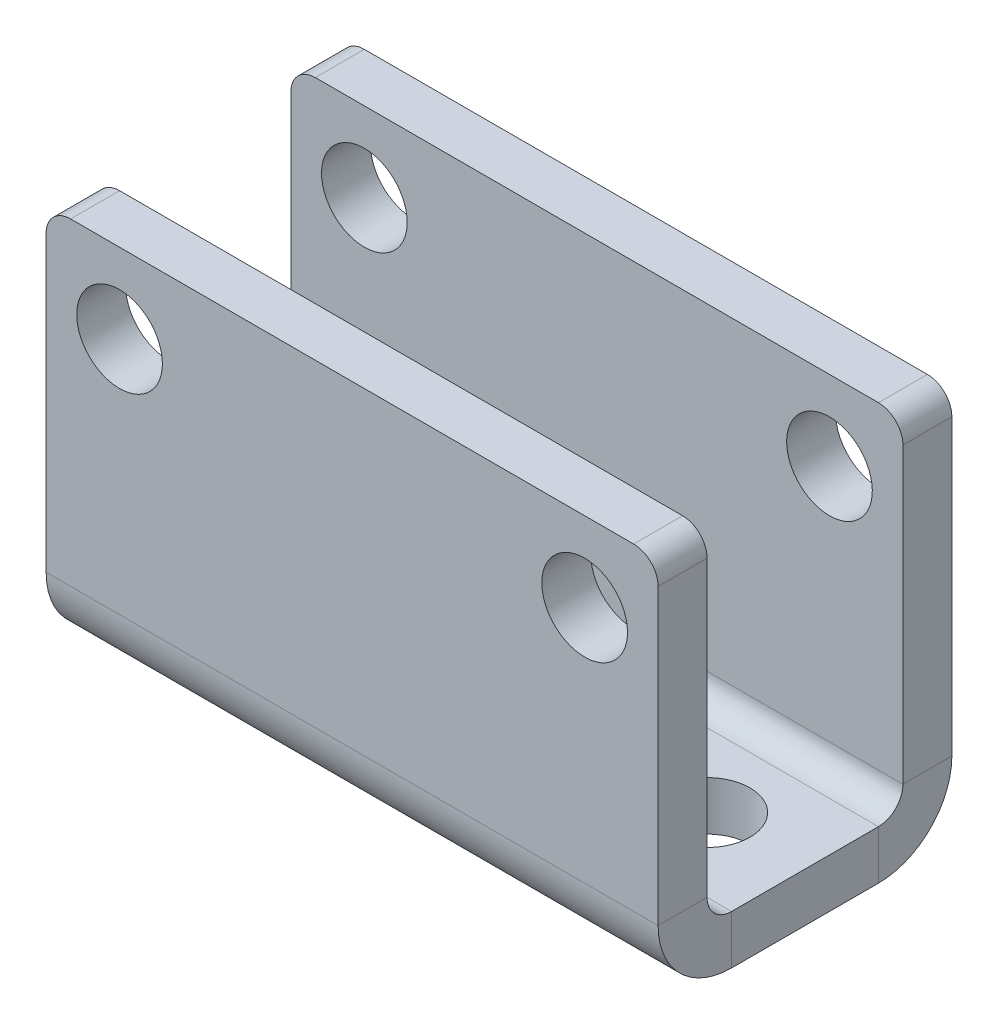
ISO-10303-21;
HEADER;
FILE_DESCRIPTION(('STEP AP214'),'2;1');
FILE_NAME('part.step','',(''),(''),'','','');
FILE_SCHEMA(('AUTOMOTIVE_DESIGN { 1 0 10303 214 1 1 1 1 }'));
ENDSEC;
DATA;
#1=APPLICATION_CONTEXT('core data for automotive mechanical design processes');
#2=APPLICATION_PROTOCOL_DEFINITION('international standard','automotive_design',2000,#1);
#3=PRODUCT_CONTEXT('',#1,'mechanical');
#4=PRODUCT('Part','Part','',(#3));
#5=PRODUCT_RELATED_PRODUCT_CATEGORY('part','',(#4));
#6=PRODUCT_DEFINITION_FORMATION('','',#4);
#7=PRODUCT_DEFINITION_CONTEXT('part definition',#1,'design');
#8=PRODUCT_DEFINITION('design','',#6,#7);
#9=PRODUCT_DEFINITION_SHAPE('','',#8);
#10=(LENGTH_UNIT() NAMED_UNIT(*) SI_UNIT(.MILLI.,.METRE.));
#11=(NAMED_UNIT(*) PLANE_ANGLE_UNIT() SI_UNIT($,.RADIAN.));
#12=(NAMED_UNIT(*) SI_UNIT($,.STERADIAN.) SOLID_ANGLE_UNIT());
#13=UNCERTAINTY_MEASURE_WITH_UNIT(LENGTH_MEASURE(1.E-05),#10,'distance_accuracy_value','');
#14=(GEOMETRIC_REPRESENTATION_CONTEXT(3) GLOBAL_UNCERTAINTY_ASSIGNED_CONTEXT((#13)) GLOBAL_UNIT_ASSIGNED_CONTEXT((#10,
#11,#12)) REPRESENTATION_CONTEXT('',''));
#15=CARTESIAN_POINT('',(0.,0.,0.));
#16=DIRECTION('',(0.,0.,1.));
#17=DIRECTION('',(1.,0.,0.));
#18=AXIS2_PLACEMENT_3D('',#15,#16,#17);
#19=CARTESIAN_POINT('',(0.,0.,-10.));
#20=DIRECTION('',(1.,0.,0.));
#21=DIRECTION('',(0.,0.,-1.));
#22=AXIS2_PLACEMENT_3D('',#19,#20,#21);
#23=PLANE('',#22);
#24=DIRECTION('',(0.,-1.,0.));
#25=VECTOR('',#24,1.);
#26=CARTESIAN_POINT('',(0.,1.99999999999996,-7.00000000000001));
#27=LINE('',#26,#25);
#28=CARTESIAN_POINT('',(0.,1.99999999999998,-7.00000000000001));
#29=VERTEX_POINT('',#28);
#30=CARTESIAN_POINT('',(0.,0.,-7.));
#31=VERTEX_POINT('',#30);
#32=EDGE_CURVE('E252',#29,#31,#27,.T.);
#33=ORIENTED_EDGE('',*,*,#32,.T.);
#34=DIRECTION('',(0.,0.,-1.));
#35=VECTOR('',#34,1.);
#36=CARTESIAN_POINT('',(0.,0.,0.));
#37=LINE('',#36,#35);
#38=CARTESIAN_POINT('',(0.,0.,-0.99999999999999));
#39=VERTEX_POINT('',#38);
#40=EDGE_CURVE('E269',#39,#31,#37,.T.);
#41=ORIENTED_EDGE('',*,*,#40,.F.);
#42=DIRECTION('',(0.,1.,0.));
#43=VECTOR('',#42,1.);
#44=CARTESIAN_POINT('',(0.,2.,-0.999999999999997));
#45=LINE('',#44,#43);
#46=CARTESIAN_POINT('',(0.,2.,-0.999999999999997));
#47=VERTEX_POINT('',#46);
#48=EDGE_CURVE('E279',#47,#39,#45,.F.);
#49=ORIENTED_EDGE('',*,*,#48,.F.);
#50=DIRECTION('',(0.,0.,1.));
#51=VECTOR('',#50,1.);
#52=CARTESIAN_POINT('',(0.,1.99999999999996,-10.));
#53=LINE('',#52,#51);
#54=EDGE_CURVE('E273',#47,#29,#53,.F.);
#55=ORIENTED_EDGE('',*,*,#54,.T.);
#56=EDGE_LOOP('',(#33,#41,#49,#55));
#57=FACE_BOUND('',#56,.T.);
#58=ADVANCED_FACE('F79',(#57),#23,.F.);
#59=CARTESIAN_POINT('',(25.,0.,0.));
#60=DIRECTION('',(-1.,0.,0.));
#61=DIRECTION('',(0.,0.,1.));
#62=AXIS2_PLACEMENT_3D('',#59,#60,#61);
#63=PLANE('',#62);
#64=DIRECTION('',(0.,-1.,0.));
#65=VECTOR('',#64,1.);
#66=CARTESIAN_POINT('',(25.,1.99999999999996,-7.00000000000001));
#67=LINE('',#66,#65);
#68=CARTESIAN_POINT('',(25.,1.99999999999996,-7.00000000000001));
#69=VERTEX_POINT('',#68);
#70=CARTESIAN_POINT('',(25.,0.,-7.));
#71=VERTEX_POINT('',#70);
#72=EDGE_CURVE('E260',#69,#71,#67,.T.);
#73=ORIENTED_EDGE('',*,*,#72,.F.);
#74=DIRECTION('',(0.,0.,-1.));
#75=VECTOR('',#74,1.);
#76=CARTESIAN_POINT('',(25.,2.,0.));
#77=LINE('',#76,#75);
#78=CARTESIAN_POINT('',(25.,2.,-0.999999999999997));
#79=VERTEX_POINT('',#78);
#80=EDGE_CURVE('E271',#69,#79,#77,.F.);
#81=ORIENTED_EDGE('',*,*,#80,.T.);
#82=DIRECTION('',(0.,1.,0.));
#83=VECTOR('',#82,1.);
#84=CARTESIAN_POINT('',(25.,0.,-0.99999999999999));
#85=LINE('',#84,#83);
#86=CARTESIAN_POINT('',(25.,0.,-0.99999999999999));
#87=VERTEX_POINT('',#86);
#88=EDGE_CURVE('E263',#79,#87,#85,.F.);
#89=ORIENTED_EDGE('',*,*,#88,.T.);
#90=DIRECTION('',(0.,0.,1.));
#91=VECTOR('',#90,1.);
#92=CARTESIAN_POINT('',(25.,0.,0.));
#93=LINE('',#92,#91);
#94=EDGE_CURVE('E266',#71,#87,#93,.T.);
#95=ORIENTED_EDGE('',*,*,#94,.F.);
#96=EDGE_LOOP('',(#73,#81,#89,#95));
#97=FACE_BOUND('',#96,.T.);
#98=ADVANCED_FACE('F425',(#97),#63,.F.);
#99=CARTESIAN_POINT('',(0.,0.,0.));
#100=DIRECTION('',(0.,1.,0.));
#101=DIRECTION('',(0.,0.,1.));
#102=AXIS2_PLACEMENT_3D('',#99,#100,#101);
#103=PLANE('',#102);
#104=CARTESIAN_POINT('',(4.,0.,-4.));
#105=DIRECTION('',(0.,1.,0.));
#106=DIRECTION('',(0.,0.,1.));
#107=AXIS2_PLACEMENT_3D('',#104,#105,#106);
#108=CIRCLE('',#107,1.75);
#109=CARTESIAN_POINT('',(4.,0.,-2.25));
#110=VERTEX_POINT('',#109);
#111=EDGE_CURVE('E371',#110,#110,#108,.T.);
#112=ORIENTED_EDGE('',*,*,#111,.T.);
#113=EDGE_LOOP('',(#112));
#114=FACE_BOUND('',#113,.T.);
#115=CARTESIAN_POINT('',(21.,0.,-4.));
#116=DIRECTION('',(0.,1.,0.));
#117=DIRECTION('',(0.,0.,1.));
#118=AXIS2_PLACEMENT_3D('',#115,#116,#117);
#119=CIRCLE('',#118,1.75);
#120=CARTESIAN_POINT('',(21.,0.,-2.25));
#121=VERTEX_POINT('',#120);
#122=EDGE_CURVE('E532',#121,#121,#119,.T.);
#123=ORIENTED_EDGE('',*,*,#122,.T.);
#124=EDGE_LOOP('',(#123));
#125=FACE_BOUND('',#124,.T.);
#126=DIRECTION('',(-1.,0.,0.));
#127=VECTOR('',#126,1.);
#128=CARTESIAN_POINT('',(0.,0.,-7.));
#129=LINE('',#128,#127);
#130=EDGE_CURVE('E204',#31,#71,#129,.F.);
#131=ORIENTED_EDGE('',*,*,#130,.T.);
#132=ORIENTED_EDGE('',*,*,#94,.T.);
#133=DIRECTION('',(-1.,0.,0.));
#134=VECTOR('',#133,1.);
#135=CARTESIAN_POINT('',(25.,0.,-0.99999999999999));
#136=LINE('',#135,#134);
#137=EDGE_CURVE('E276',#39,#87,#136,.F.);
#138=ORIENTED_EDGE('',*,*,#137,.F.);
#139=ORIENTED_EDGE('',*,*,#40,.T.);
#140=EDGE_LOOP('',(#131,#132,#138,#139));
#141=FACE_BOUND('',#140,.T.);
#142=ADVANCED_FACE('F414',(#114,#125,#141),#103,.F.);
#143=CARTESIAN_POINT('',(0.,2.,0.));
#144=DIRECTION('',(0.,1.,0.));
#145=DIRECTION('',(0.,0.,1.));
#146=AXIS2_PLACEMENT_3D('',#143,#144,#145);
#147=PLANE('',#146);
#148=CARTESIAN_POINT('',(4.,1.99999999999999,-4.));
#149=DIRECTION('',(0.,1.,0.));
#150=DIRECTION('',(0.,0.,1.));
#151=AXIS2_PLACEMENT_3D('',#148,#149,#150);
#152=CIRCLE('',#151,1.75);
#153=CARTESIAN_POINT('',(4.,1.99999999999999,-2.25));
#154=VERTEX_POINT('',#153);
#155=EDGE_CURVE('E529',#154,#154,#152,.T.);
#156=ORIENTED_EDGE('',*,*,#155,.F.);
#157=EDGE_LOOP('',(#156));
#158=FACE_BOUND('',#157,.T.);
#159=CARTESIAN_POINT('',(21.,1.99999999999999,-4.00000000000001));
#160=DIRECTION('',(0.,1.,0.));
#161=DIRECTION('',(0.,0.,-1.));
#162=AXIS2_PLACEMENT_3D('',#159,#160,#161);
#163=CIRCLE('',#162,1.75);
#164=CARTESIAN_POINT('',(21.,1.99999999999998,-5.75000000000001));
#165=VERTEX_POINT('',#164);
#166=EDGE_CURVE('E536',#165,#165,#163,.T.);
#167=ORIENTED_EDGE('',*,*,#166,.F.);
#168=EDGE_LOOP('',(#167));
#169=FACE_BOUND('',#168,.T.);
#170=ORIENTED_EDGE('',*,*,#80,.F.);
#171=DIRECTION('',(-1.,0.,0.));
#172=VECTOR('',#171,1.);
#173=CARTESIAN_POINT('',(0.,1.99999999999996,-7.00000000000001));
#174=LINE('',#173,#172);
#175=EDGE_CURVE('E256',#29,#69,#174,.F.);
#176=ORIENTED_EDGE('',*,*,#175,.F.);
#177=ORIENTED_EDGE('',*,*,#54,.F.);
#178=DIRECTION('',(-1.,0.,0.));
#179=VECTOR('',#178,1.);
#180=CARTESIAN_POINT('',(25.,2.,-0.999999999999997));
#181=LINE('',#180,#179);
#182=EDGE_CURVE('E282',#79,#47,#181,.T.);
#183=ORIENTED_EDGE('',*,*,#182,.F.);
#184=EDGE_LOOP('',(#170,#176,#177,#183));
#185=FACE_BOUND('',#184,.T.);
#186=ADVANCED_FACE('F403',(#158,#169,#185),#147,.T.);
#187=CARTESIAN_POINT('',(0.,0.,2.));
#188=DIRECTION('',(1.,0.,0.));
#189=DIRECTION('',(0.,0.,-1.));
#190=AXIS2_PLACEMENT_3D('',#187,#188,#189);
#191=PLANE('',#190);
#192=DIRECTION('',(0.,-1.,0.));
#193=VECTOR('',#192,1.);
#194=CARTESIAN_POINT('',(0.,0.,2.));
#195=LINE('',#194,#193);
#196=CARTESIAN_POINT('',(0.,15.,2.));
#197=VERTEX_POINT('',#196);
#198=CARTESIAN_POINT('',(0.,3.,2.));
#199=VERTEX_POINT('',#198);
#200=EDGE_CURVE('E309',#197,#199,#195,.T.);
#201=ORIENTED_EDGE('',*,*,#200,.F.);
#202=DIRECTION('',(0.,0.,-1.));
#203=VECTOR('',#202,1.);
#204=CARTESIAN_POINT('',(0.,15.,2.));
#205=LINE('',#204,#203);
#206=CARTESIAN_POINT('',(0.,15.,0.));
#207=VERTEX_POINT('',#206);
#208=EDGE_CURVE('E337',#197,#207,#205,.T.);
#209=ORIENTED_EDGE('',*,*,#208,.T.);
#210=DIRECTION('',(0.,-1.,0.));
#211=VECTOR('',#210,1.);
#212=CARTESIAN_POINT('',(0.,0.,0.));
#213=LINE('',#212,#211);
#214=CARTESIAN_POINT('',(0.,3.,0.));
#215=VERTEX_POINT('',#214);
#216=EDGE_CURVE('E306',#207,#215,#213,.T.);
#217=ORIENTED_EDGE('',*,*,#216,.T.);
#218=DIRECTION('',(0.,0.,1.));
#219=VECTOR('',#218,1.);
#220=CARTESIAN_POINT('',(0.,3.,0.));
#221=LINE('',#220,#219);
#222=EDGE_CURVE('E292',#215,#199,#221,.T.);
#223=ORIENTED_EDGE('',*,*,#222,.T.);
#224=EDGE_LOOP('',(#201,#209,#217,#223));
#225=FACE_BOUND('',#224,.T.);
#226=ADVANCED_FACE('F461',(#225),#191,.F.);
#227=CARTESIAN_POINT('',(25.,0.,2.));
#228=DIRECTION('',(-1.,0.,0.));
#229=DIRECTION('',(0.,-1.,0.));
#230=AXIS2_PLACEMENT_3D('',#227,#228,#229);
#231=PLANE('',#230);
#232=DIRECTION('',(0.,1.,0.));
#233=VECTOR('',#232,1.);
#234=CARTESIAN_POINT('',(25.,0.,0.));
#235=LINE('',#234,#233);
#236=CARTESIAN_POINT('',(25.,3.,0.));
#237=VERTEX_POINT('',#236);
#238=CARTESIAN_POINT('',(25.,15.,0.));
#239=VERTEX_POINT('',#238);
#240=EDGE_CURVE('E318',#237,#239,#235,.T.);
#241=ORIENTED_EDGE('',*,*,#240,.T.);
#242=DIRECTION('',(0.,0.,-1.));
#243=VECTOR('',#242,1.);
#244=CARTESIAN_POINT('',(25.,15.,2.));
#245=LINE('',#244,#243);
#246=CARTESIAN_POINT('',(25.,15.,2.));
#247=VERTEX_POINT('',#246);
#248=EDGE_CURVE('E13',#239,#247,#245,.F.);
#249=ORIENTED_EDGE('',*,*,#248,.T.);
#250=DIRECTION('',(0.,1.,0.));
#251=VECTOR('',#250,1.);
#252=CARTESIAN_POINT('',(25.,0.,2.));
#253=LINE('',#252,#251);
#254=CARTESIAN_POINT('',(25.,3.,2.));
#255=VERTEX_POINT('',#254);
#256=EDGE_CURVE('E311',#255,#247,#253,.T.);
#257=ORIENTED_EDGE('',*,*,#256,.F.);
#258=DIRECTION('',(0.,0.,1.));
#259=VECTOR('',#258,1.);
#260=CARTESIAN_POINT('',(25.,3.,0.));
#261=LINE('',#260,#259);
#262=EDGE_CURVE('E303',#237,#255,#261,.T.);
#263=ORIENTED_EDGE('',*,*,#262,.F.);
#264=EDGE_LOOP('',(#241,#249,#257,#263));
#265=FACE_BOUND('',#264,.T.);
#266=ADVANCED_FACE('F452',(#265),#231,.F.);
#267=CARTESIAN_POINT('',(0.,0.,2.));
#268=DIRECTION('',(0.,0.,-1.));
#269=DIRECTION('',(-1.,0.,0.));
#270=AXIS2_PLACEMENT_3D('',#267,#268,#269);
#271=PLANE('',#270);
#272=CARTESIAN_POINT('',(3.,12.75,2.));
#273=DIRECTION('',(0.,0.,1.));
#274=DIRECTION('',(1.,0.,0.));
#275=AXIS2_PLACEMENT_3D('',#272,#273,#274);
#276=CIRCLE('',#275,1.75);
#277=CARTESIAN_POINT('',(4.75,12.75,2.));
#278=VERTEX_POINT('',#277);
#279=EDGE_CURVE('E359',#278,#278,#276,.T.);
#280=ORIENTED_EDGE('',*,*,#279,.F.);
#281=EDGE_LOOP('',(#280));
#282=FACE_BOUND('',#281,.T.);
#283=CARTESIAN_POINT('',(22.,12.75,2.));
#284=DIRECTION('',(0.,0.,1.));
#285=DIRECTION('',(-1.,0.,0.));
#286=AXIS2_PLACEMENT_3D('',#283,#284,#285);
#287=CIRCLE('',#286,1.75);
#288=CARTESIAN_POINT('',(20.25,12.75,2.));
#289=VERTEX_POINT('',#288);
#290=EDGE_CURVE('E368',#289,#289,#287,.T.);
#291=ORIENTED_EDGE('',*,*,#290,.F.);
#292=EDGE_LOOP('',(#291));
#293=FACE_BOUND('',#292,.T.);
#294=DIRECTION('',(-1.,0.,0.));
#295=VECTOR('',#294,1.);
#296=CARTESIAN_POINT('',(0.,16.,2.));
#297=LINE('',#296,#295);
#298=CARTESIAN_POINT('',(24.,16.,2.));
#299=VERTEX_POINT('',#298);
#300=CARTESIAN_POINT('',(1.,16.,2.));
#301=VERTEX_POINT('',#300);
#302=EDGE_CURVE('E314',#299,#301,#297,.T.);
#303=ORIENTED_EDGE('',*,*,#302,.T.);
#304=CARTESIAN_POINT('',(1.,15.,2.));
#305=DIRECTION('',(0.,0.,-1.));
#306=DIRECTION('',(-1.,0.,0.));
#307=AXIS2_PLACEMENT_3D('',#304,#305,#306);
#308=CIRCLE('',#307,1.);
#309=EDGE_CURVE('E88',#301,#197,#308,.F.);
#310=ORIENTED_EDGE('',*,*,#309,.T.);
#311=ORIENTED_EDGE('',*,*,#200,.T.);
#312=DIRECTION('',(-1.,0.,0.));
#313=VECTOR('',#312,1.);
#314=CARTESIAN_POINT('',(0.,3.,2.));
#315=LINE('',#314,#313);
#316=EDGE_CURVE('E286',#199,#255,#315,.F.);
#317=ORIENTED_EDGE('',*,*,#316,.T.);
#318=ORIENTED_EDGE('',*,*,#256,.T.);
#319=CARTESIAN_POINT('',(24.,15.,2.));
#320=DIRECTION('',(0.,0.,-1.));
#321=DIRECTION('',(-1.,0.,0.));
#322=AXIS2_PLACEMENT_3D('',#319,#320,#321);
#323=CIRCLE('',#322,1.);
#324=EDGE_CURVE('E348',#247,#299,#323,.F.);
#325=ORIENTED_EDGE('',*,*,#324,.T.);
#326=EDGE_LOOP('',(#303,#310,#311,#317,#318,#325));
#327=FACE_BOUND('',#326,.T.);
#328=ADVANCED_FACE('F448',(#282,#293,#327),#271,.F.);
#329=CARTESIAN_POINT('',(0.,0.,0.));
#330=DIRECTION('',(0.,0.,-1.));
#331=DIRECTION('',(-1.,0.,0.));
#332=AXIS2_PLACEMENT_3D('',#329,#330,#331);
#333=PLANE('',#332);
#334=CARTESIAN_POINT('',(3.,12.75,0.));
#335=DIRECTION('',(0.,0.,-1.));
#336=DIRECTION('',(-1.,0.,0.));
#337=AXIS2_PLACEMENT_3D('',#334,#335,#336);
#338=CIRCLE('',#337,1.75);
#339=CARTESIAN_POINT('',(1.25,12.75,0.));
#340=VERTEX_POINT('',#339);
#341=EDGE_CURVE('E249',#340,#340,#338,.T.);
#342=ORIENTED_EDGE('',*,*,#341,.F.);
#343=EDGE_LOOP('',(#342));
#344=FACE_BOUND('',#343,.T.);
#345=CARTESIAN_POINT('',(22.,12.75,0.));
#346=DIRECTION('',(0.,0.,-1.));
#347=DIRECTION('',(-1.,0.,0.));
#348=AXIS2_PLACEMENT_3D('',#345,#346,#347);
#349=CIRCLE('',#348,1.75);
#350=CARTESIAN_POINT('',(20.25,12.75,0.));
#351=VERTEX_POINT('',#350);
#352=EDGE_CURVE('E352',#351,#351,#349,.T.);
#353=ORIENTED_EDGE('',*,*,#352,.F.);
#354=EDGE_LOOP('',(#353));
#355=FACE_BOUND('',#354,.T.);
#356=ORIENTED_EDGE('',*,*,#216,.F.);
#357=CARTESIAN_POINT('',(1.,15.,0.));
#358=DIRECTION('',(0.,0.,-1.));
#359=DIRECTION('',(-1.,0.,0.));
#360=AXIS2_PLACEMENT_3D('',#357,#358,#359);
#361=CIRCLE('',#360,1.);
#362=CARTESIAN_POINT('',(1.,16.,0.));
#363=VERTEX_POINT('',#362);
#364=EDGE_CURVE('E342',#207,#363,#361,.T.);
#365=ORIENTED_EDGE('',*,*,#364,.T.);
#366=DIRECTION('',(-1.,0.,0.));
#367=VECTOR('',#366,1.);
#368=CARTESIAN_POINT('',(0.,16.,0.));
#369=LINE('',#368,#367);
#370=CARTESIAN_POINT('',(24.,16.,0.));
#371=VERTEX_POINT('',#370);
#372=EDGE_CURVE('E312',#371,#363,#369,.T.);
#373=ORIENTED_EDGE('',*,*,#372,.F.);
#374=CARTESIAN_POINT('',(24.,15.,0.));
#375=DIRECTION('',(0.,0.,-1.));
#376=DIRECTION('',(-1.,0.,0.));
#377=AXIS2_PLACEMENT_3D('',#374,#375,#376);
#378=CIRCLE('',#377,1.);
#379=EDGE_CURVE('E340',#371,#239,#378,.T.);
#380=ORIENTED_EDGE('',*,*,#379,.T.);
#381=ORIENTED_EDGE('',*,*,#240,.F.);
#382=DIRECTION('',(-1.,0.,0.));
#383=VECTOR('',#382,1.);
#384=CARTESIAN_POINT('',(0.,3.,0.));
#385=LINE('',#384,#383);
#386=EDGE_CURVE('E298',#215,#237,#385,.F.);
#387=ORIENTED_EDGE('',*,*,#386,.F.);
#388=EDGE_LOOP('',(#356,#365,#373,#380,#381,#387));
#389=FACE_BOUND('',#388,.T.);
#390=ADVANCED_FACE('F451',(#344,#355,#389),#333,.T.);
#391=CARTESIAN_POINT('',(0.,16.,2.));
#392=DIRECTION('',(0.,-1.,0.));
#393=DIRECTION('',(0.,0.,-1.));
#394=AXIS2_PLACEMENT_3D('',#391,#392,#393);
#395=PLANE('',#394);
#396=ORIENTED_EDGE('',*,*,#372,.T.);
#397=DIRECTION('',(0.,0.,-1.));
#398=VECTOR('',#397,1.);
#399=CARTESIAN_POINT('',(1.,16.,2.));
#400=LINE('',#399,#398);
#401=EDGE_CURVE('E102',#363,#301,#400,.F.);
#402=ORIENTED_EDGE('',*,*,#401,.T.);
#403=ORIENTED_EDGE('',*,*,#302,.F.);
#404=DIRECTION('',(0.,0.,-1.));
#405=VECTOR('',#404,1.);
#406=CARTESIAN_POINT('',(24.,16.,2.));
#407=LINE('',#406,#405);
#408=EDGE_CURVE('E344',#299,#371,#407,.T.);
#409=ORIENTED_EDGE('',*,*,#408,.T.);
#410=EDGE_LOOP('',(#396,#402,#403,#409));
#411=FACE_BOUND('',#410,.T.);
#412=ADVANCED_FACE('F445',(#411),#395,.F.);
#413=CARTESIAN_POINT('',(25.,3.,-1.));
#414=DIRECTION('',(1.,0.,0.));
#415=DIRECTION('',(0.,0.,-1.));
#416=AXIS2_PLACEMENT_3D('',#413,#414,#415);
#417=PLANE('',#416);
#418=ORIENTED_EDGE('',*,*,#88,.F.);
#419=CARTESIAN_POINT('',(25.,3.,-1.));
#420=DIRECTION('',(-1.,0.,0.));
#421=DIRECTION('',(0.,0.,1.));
#422=AXIS2_PLACEMENT_3D('',#419,#420,#421);
#423=CIRCLE('',#422,1.);
#424=EDGE_CURVE('E295',#237,#79,#423,.F.);
#425=ORIENTED_EDGE('',*,*,#424,.F.);
#426=ORIENTED_EDGE('',*,*,#262,.T.);
#427=CARTESIAN_POINT('',(25.,3.,-1.));
#428=DIRECTION('',(-1.,0.,0.));
#429=DIRECTION('',(0.,0.,1.));
#430=AXIS2_PLACEMENT_3D('',#427,#428,#429);
#431=CIRCLE('',#430,3.);
#432=EDGE_CURVE('E288',#255,#87,#431,.F.);
#433=ORIENTED_EDGE('',*,*,#432,.T.);
#434=EDGE_LOOP('',(#418,#425,#426,#433));
#435=FACE_BOUND('',#434,.T.);
#436=ADVANCED_FACE('F422',(#435),#417,.T.);
#437=CARTESIAN_POINT('',(0.,3.,-1.));
#438=DIRECTION('',(1.,0.,0.));
#439=DIRECTION('',(0.,0.,-1.));
#440=AXIS2_PLACEMENT_3D('',#437,#438,#439);
#441=PLANE('',#440);
#442=CARTESIAN_POINT('',(0.,3.,-1.));
#443=DIRECTION('',(-1.,0.,0.));
#444=DIRECTION('',(0.,0.,1.));
#445=AXIS2_PLACEMENT_3D('',#442,#443,#444);
#446=CIRCLE('',#445,1.);
#447=EDGE_CURVE('E268',#47,#215,#446,.T.);
#448=ORIENTED_EDGE('',*,*,#447,.F.);
#449=ORIENTED_EDGE('',*,*,#48,.T.);
#450=CARTESIAN_POINT('',(0.,3.,-1.));
#451=DIRECTION('',(-1.,0.,0.));
#452=DIRECTION('',(0.,0.,1.));
#453=AXIS2_PLACEMENT_3D('',#450,#451,#452);
#454=CIRCLE('',#453,3.);
#455=EDGE_CURVE('E289',#39,#199,#454,.T.);
#456=ORIENTED_EDGE('',*,*,#455,.T.);
#457=ORIENTED_EDGE('',*,*,#222,.F.);
#458=EDGE_LOOP('',(#448,#449,#456,#457));
#459=FACE_BOUND('',#458,.T.);
#460=ADVANCED_FACE('F411',(#459),#441,.F.);
#461=CARTESIAN_POINT('',(0.,3.,-1.));
#462=DIRECTION('',(-1.,0.,0.));
#463=DIRECTION('',(0.,-1.,0.));
#464=AXIS2_PLACEMENT_3D('',#461,#462,#463);
#465=CYLINDRICAL_SURFACE('',#464,3.);
#466=ORIENTED_EDGE('',*,*,#316,.F.);
#467=ORIENTED_EDGE('',*,*,#455,.F.);
#468=ORIENTED_EDGE('',*,*,#137,.T.);
#469=ORIENTED_EDGE('',*,*,#432,.F.);
#470=EDGE_LOOP('',(#466,#467,#468,#469));
#471=FACE_BOUND('',#470,.T.);
#472=ADVANCED_FACE('F419',(#471),#465,.T.);
#473=CARTESIAN_POINT('',(0.,3.,-1.));
#474=DIRECTION('',(-1.,0.,0.));
#475=DIRECTION('',(0.,-1.,0.));
#476=AXIS2_PLACEMENT_3D('',#473,#474,#475);
#477=CYLINDRICAL_SURFACE('',#476,1.);
#478=ORIENTED_EDGE('',*,*,#386,.T.);
#479=ORIENTED_EDGE('',*,*,#424,.T.);
#480=ORIENTED_EDGE('',*,*,#182,.T.);
#481=ORIENTED_EDGE('',*,*,#447,.T.);
#482=EDGE_LOOP('',(#478,#479,#480,#481));
#483=FACE_BOUND('',#482,.T.);
#484=ADVANCED_FACE('F439',(#483),#477,.F.);
#485=CARTESIAN_POINT('',(25.,2.99999999999996,-7.00000000000001));
#486=DIRECTION('',(1.,0.,0.));
#487=DIRECTION('',(0.,0.,-1.));
#488=AXIS2_PLACEMENT_3D('',#485,#486,#487);
#489=PLANE('',#488);
#490=DIRECTION('',(0.,0.,1.));
#491=VECTOR('',#490,1.);
#492=CARTESIAN_POINT('',(25.,2.99999999999998,-10.));
#493=LINE('',#492,#491);
#494=CARTESIAN_POINT('',(25.,2.99999999999995,-8.00000000000001));
#495=VERTEX_POINT('',#494);
#496=CARTESIAN_POINT('',(25.,2.99999999999994,-10.));
#497=VERTEX_POINT('',#496);
#498=EDGE_CURVE('E246',#495,#497,#493,.F.);
#499=ORIENTED_EDGE('',*,*,#498,.F.);
#500=CARTESIAN_POINT('',(25.,2.99999999999996,-7.00000000000001));
#501=DIRECTION('',(-1.,0.,0.));
#502=DIRECTION('',(0.,0.,1.));
#503=AXIS2_PLACEMENT_3D('',#500,#501,#502);
#504=CIRCLE('',#503,1.);
#505=EDGE_CURVE('E207',#69,#495,#504,.F.);
#506=ORIENTED_EDGE('',*,*,#505,.F.);
#507=ORIENTED_EDGE('',*,*,#72,.T.);
#508=CARTESIAN_POINT('',(25.,2.99999999999996,-7.00000000000001));
#509=DIRECTION('',(-1.,0.,0.));
#510=DIRECTION('',(0.,0.,1.));
#511=AXIS2_PLACEMENT_3D('',#508,#509,#510);
#512=CIRCLE('',#511,3.);
#513=EDGE_CURVE('E251',#71,#497,#512,.F.);
#514=ORIENTED_EDGE('',*,*,#513,.T.);
#515=EDGE_LOOP('',(#499,#506,#507,#514));
#516=FACE_BOUND('',#515,.T.);
#517=ADVANCED_FACE('F397',(#516),#489,.T.);
#518=CARTESIAN_POINT('',(0.,2.99999999999996,-7.00000000000001));
#519=DIRECTION('',(1.,0.,0.));
#520=DIRECTION('',(0.,0.,-1.));
#521=AXIS2_PLACEMENT_3D('',#518,#519,#520);
#522=PLANE('',#521);
#523=CARTESIAN_POINT('',(0.,2.99999999999996,-7.00000000000001));
#524=DIRECTION('',(-1.,0.,0.));
#525=DIRECTION('',(0.,0.,1.));
#526=AXIS2_PLACEMENT_3D('',#523,#524,#525);
#527=CIRCLE('',#526,1.);
#528=CARTESIAN_POINT('',(0.,2.99999999999995,-8.00000000000001));
#529=VERTEX_POINT('',#528);
#530=EDGE_CURVE('E214',#529,#29,#527,.T.);
#531=ORIENTED_EDGE('',*,*,#530,.F.);
#532=DIRECTION('',(0.,0.,1.));
#533=VECTOR('',#532,1.);
#534=CARTESIAN_POINT('',(0.,2.99999999999997,-8.00000000000001));
#535=LINE('',#534,#533);
#536=CARTESIAN_POINT('',(0.,2.99999999999998,-10.));
#537=VERTEX_POINT('',#536);
#538=EDGE_CURVE('E211',#529,#537,#535,.F.);
#539=ORIENTED_EDGE('',*,*,#538,.T.);
#540=CARTESIAN_POINT('',(0.,2.99999999999996,-7.00000000000001));
#541=DIRECTION('',(-1.,0.,0.));
#542=DIRECTION('',(0.,0.,1.));
#543=AXIS2_PLACEMENT_3D('',#540,#541,#542);
#544=CIRCLE('',#543,3.);
#545=EDGE_CURVE('E197',#537,#31,#544,.T.);
#546=ORIENTED_EDGE('',*,*,#545,.T.);
#547=ORIENTED_EDGE('',*,*,#32,.F.);
#548=EDGE_LOOP('',(#531,#539,#546,#547));
#549=FACE_BOUND('',#548,.T.);
#550=ADVANCED_FACE('F212',(#549),#522,.F.);
#551=CARTESIAN_POINT('',(0.,2.99999999999996,-7.00000000000001));
#552=DIRECTION('',(-1.,0.,0.));
#553=DIRECTION('',(0.,0.,-1.));
#554=AXIS2_PLACEMENT_3D('',#551,#552,#553);
#555=CYLINDRICAL_SURFACE('',#554,3.);
#556=ORIENTED_EDGE('',*,*,#130,.F.);
#557=ORIENTED_EDGE('',*,*,#545,.F.);
#558=DIRECTION('',(-1.,0.,0.));
#559=VECTOR('',#558,1.);
#560=CARTESIAN_POINT('',(25.,2.99999999999998,-10.));
#561=LINE('',#560,#559);
#562=EDGE_CURVE('E202',#537,#497,#561,.F.);
#563=ORIENTED_EDGE('',*,*,#562,.T.);
#564=ORIENTED_EDGE('',*,*,#513,.F.);
#565=EDGE_LOOP('',(#556,#557,#563,#564));
#566=FACE_BOUND('',#565,.T.);
#567=ADVANCED_FACE('F199',(#566),#555,.T.);
#568=CARTESIAN_POINT('',(0.,2.99999999999996,-7.00000000000001));
#569=DIRECTION('',(-1.,0.,0.));
#570=DIRECTION('',(0.,0.,-1.));
#571=AXIS2_PLACEMENT_3D('',#568,#569,#570);
#572=CYLINDRICAL_SURFACE('',#571,1.);
#573=ORIENTED_EDGE('',*,*,#175,.T.);
#574=ORIENTED_EDGE('',*,*,#505,.T.);
#575=DIRECTION('',(-1.,0.,0.));
#576=VECTOR('',#575,1.);
#577=CARTESIAN_POINT('',(25.,2.99999999999997,-8.00000000000001));
#578=LINE('',#577,#576);
#579=EDGE_CURVE('E219',#495,#529,#578,.T.);
#580=ORIENTED_EDGE('',*,*,#579,.T.);
#581=ORIENTED_EDGE('',*,*,#530,.T.);
#582=EDGE_LOOP('',(#573,#574,#580,#581));
#583=FACE_BOUND('',#582,.T.);
#584=ADVANCED_FACE('F399',(#583),#572,.F.);
#585=CARTESIAN_POINT('',(0.,16.,-10.0000000000001));
#586=DIRECTION('',(1.,0.,0.));
#587=DIRECTION('',(0.,0.,-1.));
#588=AXIS2_PLACEMENT_3D('',#585,#586,#587);
#589=PLANE('',#588);
#590=DIRECTION('',(0.,-1.,0.));
#591=VECTOR('',#590,1.);
#592=CARTESIAN_POINT('',(0.,16.,-8.0000000000001));
#593=LINE('',#592,#591);
#594=CARTESIAN_POINT('',(0.,15.,-8.0000000000001));
#595=VERTEX_POINT('',#594);
#596=EDGE_CURVE('E229',#529,#595,#593,.F.);
#597=ORIENTED_EDGE('',*,*,#596,.T.);
#598=DIRECTION('',(0.,0.,1.));
#599=VECTOR('',#598,1.);
#600=CARTESIAN_POINT('',(0.,15.,-10.0000000000001));
#601=LINE('',#600,#599);
#602=CARTESIAN_POINT('',(0.,15.,-10.0000000000001));
#603=VERTEX_POINT('',#602);
#604=EDGE_CURVE('E233',#595,#603,#601,.F.);
#605=ORIENTED_EDGE('',*,*,#604,.T.);
#606=DIRECTION('',(0.,1.,0.));
#607=VECTOR('',#606,1.);
#608=CARTESIAN_POINT('',(0.,0.,-9.99999999999999));
#609=LINE('',#608,#607);
#610=EDGE_CURVE('E225',#537,#603,#609,.T.);
#611=ORIENTED_EDGE('',*,*,#610,.F.);
#612=ORIENTED_EDGE('',*,*,#538,.F.);
#613=EDGE_LOOP('',(#597,#605,#611,#612));
#614=FACE_BOUND('',#613,.T.);
#615=ADVANCED_FACE('F231',(#614),#589,.F.);
#616=CARTESIAN_POINT('',(25.,1.99999999999996,-10.));
#617=DIRECTION('',(-1.,0.,0.));
#618=DIRECTION('',(0.,0.,1.));
#619=AXIS2_PLACEMENT_3D('',#616,#617,#618);
#620=PLANE('',#619);
#621=DIRECTION('',(0.,-1.,0.));
#622=VECTOR('',#621,1.);
#623=CARTESIAN_POINT('',(25.,0.,-9.99999999999999));
#624=LINE('',#623,#622);
#625=CARTESIAN_POINT('',(25.,15.,-10.0000000000001));
#626=VERTEX_POINT('',#625);
#627=EDGE_CURVE('E228',#626,#497,#624,.T.);
#628=ORIENTED_EDGE('',*,*,#627,.F.);
#629=DIRECTION('',(0.,0.,1.));
#630=VECTOR('',#629,1.);
#631=CARTESIAN_POINT('',(25.,15.,-10.0000000000001));
#632=LINE('',#631,#630);
#633=CARTESIAN_POINT('',(25.,15.,-8.0000000000001));
#634=VERTEX_POINT('',#633);
#635=EDGE_CURVE('E316',#626,#634,#632,.T.);
#636=ORIENTED_EDGE('',*,*,#635,.T.);
#637=DIRECTION('',(0.,1.,0.));
#638=VECTOR('',#637,1.);
#639=CARTESIAN_POINT('',(25.,1.99999999999997,-8.00000000000001));
#640=LINE('',#639,#638);
#641=EDGE_CURVE('E235',#634,#495,#640,.F.);
#642=ORIENTED_EDGE('',*,*,#641,.T.);
#643=ORIENTED_EDGE('',*,*,#498,.T.);
#644=EDGE_LOOP('',(#628,#636,#642,#643));
#645=FACE_BOUND('',#644,.T.);
#646=ADVANCED_FACE('F393',(#645),#620,.F.);
#647=CARTESIAN_POINT('',(0.,0.,-9.99999999999999));
#648=DIRECTION('',(0.,0.,1.));
#649=DIRECTION('',(0.,-1.,0.));
#650=AXIS2_PLACEMENT_3D('',#647,#648,#649);
#651=PLANE('',#650);
#652=CARTESIAN_POINT('',(3.,12.75,-10.0000000000001));
#653=DIRECTION('',(0.,0.,1.));
#654=DIRECTION('',(0.,-1.,0.));
#655=AXIS2_PLACEMENT_3D('',#652,#653,#654);
#656=CIRCLE('',#655,1.75);
#657=CARTESIAN_POINT('',(3.,11.,-10.0000000000001));
#658=VERTEX_POINT('',#657);
#659=EDGE_CURVE('E353',#658,#658,#656,.F.);
#660=ORIENTED_EDGE('',*,*,#659,.F.);
#661=EDGE_LOOP('',(#660));
#662=FACE_BOUND('',#661,.T.);
#663=CARTESIAN_POINT('',(22.,12.75,-10.0000000000001));
#664=DIRECTION('',(0.,0.,1.));
#665=DIRECTION('',(0.,-1.,0.));
#666=AXIS2_PLACEMENT_3D('',#663,#664,#665);
#667=CIRCLE('',#666,1.75);
#668=CARTESIAN_POINT('',(22.,11.,-10.0000000000001));
#669=VERTEX_POINT('',#668);
#670=EDGE_CURVE('E364',#669,#669,#667,.F.);
#671=ORIENTED_EDGE('',*,*,#670,.F.);
#672=EDGE_LOOP('',(#671));
#673=FACE_BOUND('',#672,.T.);
#674=DIRECTION('',(1.,0.,0.));
#675=VECTOR('',#674,1.);
#676=CARTESIAN_POINT('',(0.,16.,-10.0000000000001));
#677=LINE('',#676,#675);
#678=CARTESIAN_POINT('',(1.,16.,-10.0000000000001));
#679=VERTEX_POINT('',#678);
#680=CARTESIAN_POINT('',(24.,16.,-10.0000000000001));
#681=VERTEX_POINT('',#680);
#682=EDGE_CURVE('E234',#679,#681,#677,.T.);
#683=ORIENTED_EDGE('',*,*,#682,.T.);
#684=CARTESIAN_POINT('',(24.,15.,-10.0000000000001));
#685=DIRECTION('',(0.,0.,1.));
#686=DIRECTION('',(0.,-1.,0.));
#687=AXIS2_PLACEMENT_3D('',#684,#685,#686);
#688=CIRCLE('',#687,1.);
#689=EDGE_CURVE('E334',#681,#626,#688,.F.);
#690=ORIENTED_EDGE('',*,*,#689,.T.);
#691=ORIENTED_EDGE('',*,*,#627,.T.);
#692=ORIENTED_EDGE('',*,*,#562,.F.);
#693=ORIENTED_EDGE('',*,*,#610,.T.);
#694=CARTESIAN_POINT('',(1.,15.,-10.0000000000001));
#695=DIRECTION('',(0.,0.,1.));
#696=DIRECTION('',(0.,-1.,0.));
#697=AXIS2_PLACEMENT_3D('',#694,#695,#696);
#698=CIRCLE('',#697,1.);
#699=EDGE_CURVE('E332',#603,#679,#698,.F.);
#700=ORIENTED_EDGE('',*,*,#699,.T.);
#701=EDGE_LOOP('',(#683,#690,#691,#692,#693,#700));
#702=FACE_BOUND('',#701,.T.);
#703=ADVANCED_FACE('F224',(#662,#673,#702),#651,.F.);
#704=CARTESIAN_POINT('',(0.,0.,-7.99999999999999));
#705=DIRECTION('',(0.,0.,1.));
#706=DIRECTION('',(0.,-1.,0.));
#707=AXIS2_PLACEMENT_3D('',#704,#705,#706);
#708=PLANE('',#707);
#709=CARTESIAN_POINT('',(3.,12.75,-8.00000000000008));
#710=DIRECTION('',(0.,0.,1.));
#711=DIRECTION('',(0.,-1.,0.));
#712=AXIS2_PLACEMENT_3D('',#709,#710,#711);
#713=CIRCLE('',#712,1.75);
#714=CARTESIAN_POINT('',(3.,11.,-8.00000000000007));
#715=VERTEX_POINT('',#714);
#716=EDGE_CURVE('E83',#715,#715,#713,.T.);
#717=ORIENTED_EDGE('',*,*,#716,.F.);
#718=EDGE_LOOP('',(#717));
#719=FACE_BOUND('',#718,.T.);
#720=CARTESIAN_POINT('',(22.,12.75,-8.00000000000008));
#721=DIRECTION('',(0.,0.,1.));
#722=DIRECTION('',(0.,-1.,0.));
#723=AXIS2_PLACEMENT_3D('',#720,#721,#722);
#724=CIRCLE('',#723,1.75);
#725=CARTESIAN_POINT('',(22.,11.,-8.00000000000007));
#726=VERTEX_POINT('',#725);
#727=EDGE_CURVE('E350',#726,#726,#724,.T.);
#728=ORIENTED_EDGE('',*,*,#727,.F.);
#729=EDGE_LOOP('',(#728));
#730=FACE_BOUND('',#729,.T.);
#731=ORIENTED_EDGE('',*,*,#641,.F.);
#732=CARTESIAN_POINT('',(24.,15.,-8.0000000000001));
#733=DIRECTION('',(0.,0.,1.));
#734=DIRECTION('',(0.,-1.,0.));
#735=AXIS2_PLACEMENT_3D('',#732,#733,#734);
#736=CIRCLE('',#735,1.);
#737=CARTESIAN_POINT('',(24.,16.,-8.0000000000001));
#738=VERTEX_POINT('',#737);
#739=EDGE_CURVE('E325',#634,#738,#736,.T.);
#740=ORIENTED_EDGE('',*,*,#739,.T.);
#741=DIRECTION('',(-1.,0.,0.));
#742=VECTOR('',#741,1.);
#743=CARTESIAN_POINT('',(25.,16.,-8.0000000000001));
#744=LINE('',#743,#742);
#745=CARTESIAN_POINT('',(1.,16.,-8.0000000000001));
#746=VERTEX_POINT('',#745);
#747=EDGE_CURVE('E238',#746,#738,#744,.F.);
#748=ORIENTED_EDGE('',*,*,#747,.F.);
#749=CARTESIAN_POINT('',(1.,15.,-8.0000000000001));
#750=DIRECTION('',(0.,0.,1.));
#751=DIRECTION('',(0.,-1.,0.));
#752=AXIS2_PLACEMENT_3D('',#749,#750,#751);
#753=CIRCLE('',#752,1.);
#754=EDGE_CURVE('E323',#746,#595,#753,.T.);
#755=ORIENTED_EDGE('',*,*,#754,.T.);
#756=ORIENTED_EDGE('',*,*,#596,.F.);
#757=ORIENTED_EDGE('',*,*,#579,.F.);
#758=EDGE_LOOP('',(#731,#740,#748,#755,#756,#757));
#759=FACE_BOUND('',#758,.T.);
#760=ADVANCED_FACE('F382',(#719,#730,#759),#708,.T.);
#761=CARTESIAN_POINT('',(25.,16.,-10.0000000000001));
#762=DIRECTION('',(0.,-1.,0.));
#763=DIRECTION('',(0.,0.,-1.));
#764=AXIS2_PLACEMENT_3D('',#761,#762,#763);
#765=PLANE('',#764);
#766=ORIENTED_EDGE('',*,*,#747,.T.);
#767=DIRECTION('',(0.,0.,1.));
#768=VECTOR('',#767,1.);
#769=CARTESIAN_POINT('',(24.,16.,-10.0000000000001));
#770=LINE('',#769,#768);
#771=EDGE_CURVE('E330',#738,#681,#770,.F.);
#772=ORIENTED_EDGE('',*,*,#771,.T.);
#773=ORIENTED_EDGE('',*,*,#682,.F.);
#774=DIRECTION('',(0.,0.,1.));
#775=VECTOR('',#774,1.);
#776=CARTESIAN_POINT('',(1.,16.,-10.0000000000001));
#777=LINE('',#776,#775);
#778=EDGE_CURVE('E327',#679,#746,#777,.T.);
#779=ORIENTED_EDGE('',*,*,#778,.T.);
#780=EDGE_LOOP('',(#766,#772,#773,#779));
#781=FACE_BOUND('',#780,.T.);
#782=ADVANCED_FACE('F385',(#781),#765,.F.);
#783=CARTESIAN_POINT('',(24.,15.,-10.0000000000001));
#784=DIRECTION('',(0.,0.,1.));
#785=DIRECTION('',(0.,-1.,0.));
#786=AXIS2_PLACEMENT_3D('',#783,#784,#785);
#787=CYLINDRICAL_SURFACE('',#786,1.);
#788=ORIENTED_EDGE('',*,*,#689,.F.);
#789=ORIENTED_EDGE('',*,*,#771,.F.);
#790=ORIENTED_EDGE('',*,*,#739,.F.);
#791=ORIENTED_EDGE('',*,*,#635,.F.);
#792=EDGE_LOOP('',(#788,#789,#790,#791));
#793=FACE_BOUND('',#792,.T.);
#794=ADVANCED_FACE('F465',(#793),#787,.T.);
#795=CARTESIAN_POINT('',(1.,15.,-10.0000000000001));
#796=DIRECTION('',(0.,0.,1.));
#797=DIRECTION('',(0.,-1.,0.));
#798=AXIS2_PLACEMENT_3D('',#795,#796,#797);
#799=CYLINDRICAL_SURFACE('',#798,1.);
#800=ORIENTED_EDGE('',*,*,#699,.F.);
#801=ORIENTED_EDGE('',*,*,#604,.F.);
#802=ORIENTED_EDGE('',*,*,#754,.F.);
#803=ORIENTED_EDGE('',*,*,#778,.F.);
#804=EDGE_LOOP('',(#800,#801,#802,#803));
#805=FACE_BOUND('',#804,.T.);
#806=ADVANCED_FACE('F468',(#805),#799,.T.);
#807=CARTESIAN_POINT('',(1.,15.,2.));
#808=DIRECTION('',(0.,0.,-1.));
#809=DIRECTION('',(-1.,0.,0.));
#810=AXIS2_PLACEMENT_3D('',#807,#808,#809);
#811=CYLINDRICAL_SURFACE('',#810,1.);
#812=ORIENTED_EDGE('',*,*,#309,.F.);
#813=ORIENTED_EDGE('',*,*,#401,.F.);
#814=ORIENTED_EDGE('',*,*,#364,.F.);
#815=ORIENTED_EDGE('',*,*,#208,.F.);
#816=EDGE_LOOP('',(#812,#813,#814,#815));
#817=FACE_BOUND('',#816,.T.);
#818=ADVANCED_FACE('F471',(#817),#811,.T.);
#819=CARTESIAN_POINT('',(24.,15.,2.));
#820=DIRECTION('',(0.,0.,-1.));
#821=DIRECTION('',(-1.,0.,0.));
#822=AXIS2_PLACEMENT_3D('',#819,#820,#821);
#823=CYLINDRICAL_SURFACE('',#822,1.);
#824=ORIENTED_EDGE('',*,*,#324,.F.);
#825=ORIENTED_EDGE('',*,*,#248,.F.);
#826=ORIENTED_EDGE('',*,*,#379,.F.);
#827=ORIENTED_EDGE('',*,*,#408,.F.);
#828=EDGE_LOOP('',(#824,#825,#826,#827));
#829=FACE_BOUND('',#828,.T.);
#830=ADVANCED_FACE('F81',(#829),#823,.T.);
#831=CARTESIAN_POINT('',(22.,12.75,-14.9497474683059));
#832=DIRECTION('',(0.,0.,1.));
#833=DIRECTION('',(1.,0.,0.));
#834=AXIS2_PLACEMENT_3D('',#831,#832,#833);
#835=CYLINDRICAL_SURFACE('',#834,1.75);
#836=ORIENTED_EDGE('',*,*,#727,.T.);
#837=EDGE_LOOP('',(#836));
#838=FACE_BOUND('',#837,.T.);
#839=ORIENTED_EDGE('',*,*,#670,.T.);
#840=EDGE_LOOP('',(#839));
#841=FACE_BOUND('',#840,.T.);
#842=ADVANCED_FACE('F478',(#838,#841),#835,.F.);
#843=CARTESIAN_POINT('',(3.,12.75,-14.9497474683059));
#844=DIRECTION('',(0.,0.,1.));
#845=DIRECTION('',(1.,0.,0.));
#846=AXIS2_PLACEMENT_3D('',#843,#844,#845);
#847=CYLINDRICAL_SURFACE('',#846,1.75);
#848=ORIENTED_EDGE('',*,*,#716,.T.);
#849=EDGE_LOOP('',(#848));
#850=FACE_BOUND('',#849,.T.);
#851=ORIENTED_EDGE('',*,*,#659,.T.);
#852=EDGE_LOOP('',(#851));
#853=FACE_BOUND('',#852,.T.);
#854=ADVANCED_FACE('F380',(#850,#853),#847,.F.);
#855=ORIENTED_EDGE('',*,*,#352,.T.);
#856=EDGE_LOOP('',(#855));
#857=FACE_BOUND('',#856,.T.);
#858=ORIENTED_EDGE('',*,*,#290,.T.);
#859=EDGE_LOOP('',(#858));
#860=FACE_BOUND('',#859,.T.);
#861=ADVANCED_FACE('F495',(#857,#860),#835,.F.);
#862=ORIENTED_EDGE('',*,*,#341,.T.);
#863=EDGE_LOOP('',(#862));
#864=FACE_BOUND('',#863,.T.);
#865=ORIENTED_EDGE('',*,*,#279,.T.);
#866=EDGE_LOOP('',(#865));
#867=FACE_BOUND('',#866,.T.);
#868=ADVANCED_FACE('F500',(#864,#867),#847,.F.);
#869=CARTESIAN_POINT('',(21.,-8.00000000000001,-3.99999999999997));
#870=DIRECTION('',(0.,1.,0.));
#871=DIRECTION('',(0.,0.,1.));
#872=AXIS2_PLACEMENT_3D('',#869,#870,#871);
#873=CYLINDRICAL_SURFACE('',#872,1.75);
#874=ORIENTED_EDGE('',*,*,#166,.T.);
#875=EDGE_LOOP('',(#874));
#876=FACE_BOUND('',#875,.T.);
#877=ORIENTED_EDGE('',*,*,#122,.F.);
#878=EDGE_LOOP('',(#877));
#879=FACE_BOUND('',#878,.T.);
#880=ADVANCED_FACE('F508',(#876,#879),#873,.F.);
#881=CARTESIAN_POINT('',(4.,-8.00000000000001,-3.99999999999997));
#882=DIRECTION('',(0.,1.,0.));
#883=DIRECTION('',(0.,0.,1.));
#884=AXIS2_PLACEMENT_3D('',#881,#882,#883);
#885=CYLINDRICAL_SURFACE('',#884,1.75);
#886=ORIENTED_EDGE('',*,*,#155,.T.);
#887=EDGE_LOOP('',(#886));
#888=FACE_BOUND('',#887,.T.);
#889=ORIENTED_EDGE('',*,*,#111,.F.);
#890=EDGE_LOOP('',(#889));
#891=FACE_BOUND('',#890,.T.);
#892=ADVANCED_FACE('F517',(#888,#891),#885,.F.);
#893=CLOSED_SHELL('',(#58,#98,#142,#186,#226,#266,#328,#390,#412,#436,#460,#472,#484,#517,#550,
#567,#584,#615,#646,#703,#760,#782,#794,#806,#818,#830,#842,#854,#861,#868,#880,#892));
#894=MANIFOLD_SOLID_BREP('B2',#893);
#895=ADVANCED_BREP_SHAPE_REPRESENTATION('',(#18,#894),#14);
#896=SHAPE_DEFINITION_REPRESENTATION(#9,#895);
ENDSEC;
END-ISO-10303-21;
